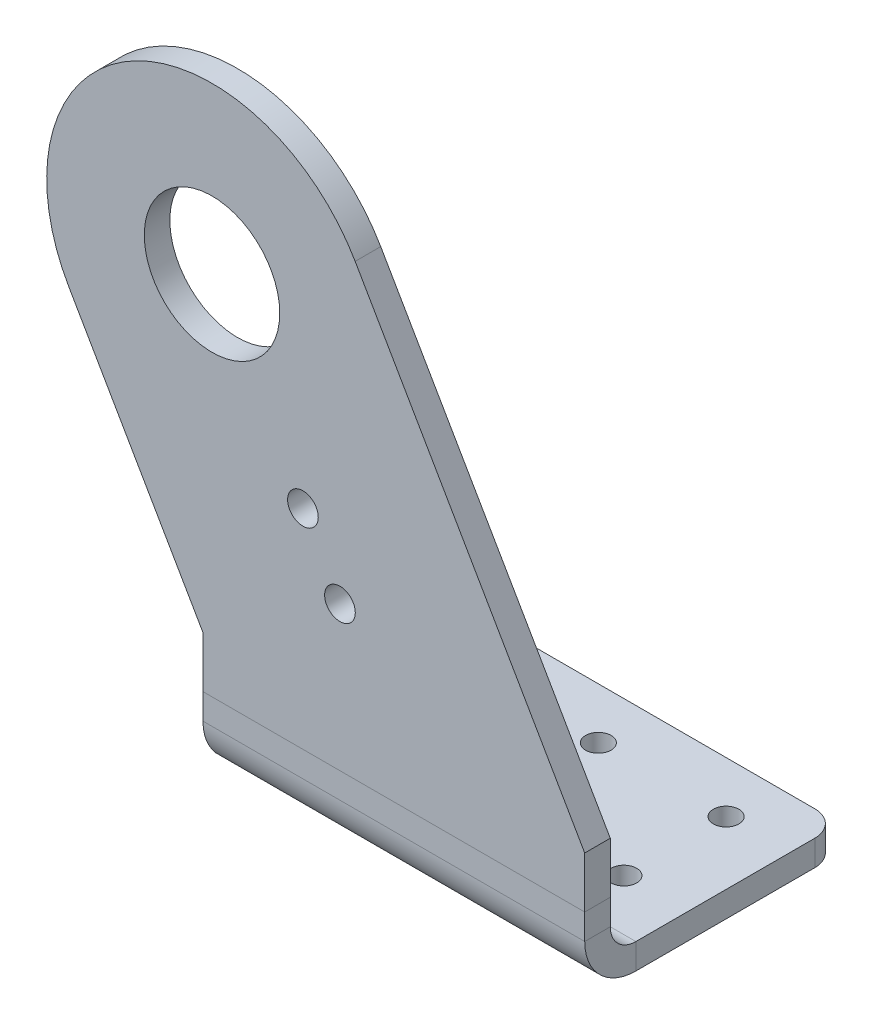
ISO-10303-21;
HEADER;
FILE_DESCRIPTION(('STEP AP214'),'2;1');
FILE_NAME('part.step','',(''),(''),'','','');
FILE_SCHEMA(('AUTOMOTIVE_DESIGN { 1 0 10303 214 1 1 1 1 }'));
ENDSEC;
DATA;
#1=APPLICATION_CONTEXT('core data for automotive mechanical design processes');
#2=APPLICATION_PROTOCOL_DEFINITION('international standard','automotive_design',2000,#1);
#3=PRODUCT_CONTEXT('',#1,'mechanical');
#4=PRODUCT('Part','Part','',(#3));
#5=PRODUCT_RELATED_PRODUCT_CATEGORY('part','',(#4));
#6=PRODUCT_DEFINITION_FORMATION('','',#4);
#7=PRODUCT_DEFINITION_CONTEXT('part definition',#1,'design');
#8=PRODUCT_DEFINITION('design','',#6,#7);
#9=PRODUCT_DEFINITION_SHAPE('','',#8);
#10=(LENGTH_UNIT() NAMED_UNIT(*) SI_UNIT(.MILLI.,.METRE.));
#11=(NAMED_UNIT(*) PLANE_ANGLE_UNIT() SI_UNIT($,.RADIAN.));
#12=(NAMED_UNIT(*) SI_UNIT($,.STERADIAN.) SOLID_ANGLE_UNIT());
#13=UNCERTAINTY_MEASURE_WITH_UNIT(LENGTH_MEASURE(1.E-05),#10,'distance_accuracy_value','');
#14=(GEOMETRIC_REPRESENTATION_CONTEXT(3) GLOBAL_UNCERTAINTY_ASSIGNED_CONTEXT((#13)) GLOBAL_UNIT_ASSIGNED_CONTEXT((#10,
#11,#12)) REPRESENTATION_CONTEXT('',''));
#15=CARTESIAN_POINT('',(0.,0.,0.));
#16=DIRECTION('',(0.,0.,1.));
#17=DIRECTION('',(1.,0.,0.));
#18=AXIS2_PLACEMENT_3D('',#15,#16,#17);
#19=CARTESIAN_POINT('',(51.5597538847893,-65.6863227653069,-5.));
#20=DIRECTION('',(1.,0.,0.));
#21=DIRECTION('',(0.,1.,0.));
#22=AXIS2_PLACEMENT_3D('',#19,#20,#21);
#23=PLANE('',#22);
#24=DIRECTION('',(0.,-1.,0.));
#25=VECTOR('',#24,1.);
#26=CARTESIAN_POINT('',(51.5597538847893,-65.6863227653069,-5.));
#27=LINE('',#26,#25);
#28=CARTESIAN_POINT('',(51.5597538847893,-65.6863227653069,-5.));
#29=VERTEX_POINT('',#28);
#30=CARTESIAN_POINT('',(51.5597538847893,-70.6863227653069,-5.));
#31=VERTEX_POINT('',#30);
#32=EDGE_CURVE('E181',#29,#31,#27,.T.);
#33=ORIENTED_EDGE('',*,*,#32,.F.);
#34=CARTESIAN_POINT('',(51.5597538847893,-60.6863227653069,-5.));
#35=DIRECTION('',(1.,0.,0.));
#36=DIRECTION('',(0.,1.,0.));
#37=AXIS2_PLACEMENT_3D('',#34,#35,#36);
#38=CIRCLE('',#37,5.);
#39=CARTESIAN_POINT('',(51.5597538847893,-60.6863227653069,0.));
#40=VERTEX_POINT('',#39);
#41=EDGE_CURVE('E222',#40,#29,#38,.T.);
#42=ORIENTED_EDGE('',*,*,#41,.F.);
#43=DIRECTION('',(0.,0.,-1.));
#44=VECTOR('',#43,1.);
#45=CARTESIAN_POINT('',(51.5597538847893,-60.6863227653069,5.));
#46=LINE('',#45,#44);
#47=CARTESIAN_POINT('',(51.5597538847893,-60.6863227653069,5.));
#48=VERTEX_POINT('',#47);
#49=EDGE_CURVE('E179',#48,#40,#46,.T.);
#50=ORIENTED_EDGE('',*,*,#49,.F.);
#51=CARTESIAN_POINT('',(51.5597538847893,-60.6863227653069,-5.));
#52=DIRECTION('',(1.,0.,0.));
#53=DIRECTION('',(0.,0.,-1.));
#54=AXIS2_PLACEMENT_3D('',#51,#52,#53);
#55=CIRCLE('',#54,10.);
#56=EDGE_CURVE('E178',#48,#31,#55,.T.);
#57=ORIENTED_EDGE('',*,*,#56,.T.);
#58=EDGE_LOOP('',(#33,#42,#50,#57));
#59=FACE_BOUND('',#58,.T.);
#60=ADVANCED_FACE('F51',(#59),#23,.T.);
#61=CARTESIAN_POINT('',(51.5597538847893,-60.6863227653069,5.));
#62=DIRECTION('',(1.,0.,0.));
#63=DIRECTION('',(0.,1.,0.));
#64=AXIS2_PLACEMENT_3D('',#61,#62,#63);
#65=PLANE('',#64);
#66=DIRECTION('',(0.,0.,-1.));
#67=VECTOR('',#66,1.);
#68=CARTESIAN_POINT('',(51.5597538847893,-70.6863227653069,-5.));
#69=LINE('',#68,#67);
#70=CARTESIAN_POINT('',(51.5597538847893,-70.6863227653069,-40.));
#71=VERTEX_POINT('',#70);
#72=EDGE_CURVE('E213',#31,#71,#69,.T.);
#73=ORIENTED_EDGE('',*,*,#72,.T.);
#74=DIRECTION('',(0.,-1.,0.));
#75=VECTOR('',#74,1.);
#76=CARTESIAN_POINT('',(51.5597538847893,-65.6863227653069,-40.));
#77=LINE('',#76,#75);
#78=CARTESIAN_POINT('',(51.5597538847893,-65.6863227653069,-40.));
#79=VERTEX_POINT('',#78);
#80=EDGE_CURVE('E12',#71,#79,#77,.F.);
#81=ORIENTED_EDGE('',*,*,#80,.T.);
#82=DIRECTION('',(0.,0.,-1.));
#83=VECTOR('',#82,1.);
#84=CARTESIAN_POINT('',(51.5597538847893,-65.6863227653069,-5.));
#85=LINE('',#84,#83);
#86=EDGE_CURVE('E219',#29,#79,#85,.T.);
#87=ORIENTED_EDGE('',*,*,#86,.F.);
#88=ORIENTED_EDGE('',*,*,#32,.T.);
#89=EDGE_LOOP('',(#73,#81,#87,#88));
#90=FACE_BOUND('',#89,.T.);
#91=ADVANCED_FACE('F253',(#90),#65,.T.);
#92=CARTESIAN_POINT('',(-75.3237340684686,-70.686322765307,-5.));
#93=DIRECTION('',(0.,-1.,0.));
#94=DIRECTION('',(1.,0.,0.));
#95=AXIS2_PLACEMENT_3D('',#92,#93,#94);
#96=PLANE('',#95);
#97=CARTESIAN_POINT('',(-10.7812238195632,-70.686322765307,-35.));
#98=DIRECTION('',(0.,1.,0.));
#99=DIRECTION('',(-1.,0.,0.));
#100=AXIS2_PLACEMENT_3D('',#97,#98,#99);
#101=CIRCLE('',#100,2.5);
#102=CARTESIAN_POINT('',(-13.2812238195632,-70.686322765307,-35.));
#103=VERTEX_POINT('',#102);
#104=EDGE_CURVE('E331',#103,#103,#101,.T.);
#105=ORIENTED_EDGE('',*,*,#104,.T.);
#106=EDGE_LOOP('',(#105));
#107=FACE_BOUND('',#106,.T.);
#108=CARTESIAN_POINT('',(-10.7812238195632,-70.686322765307,-15.));
#109=DIRECTION('',(0.,1.,0.));
#110=DIRECTION('',(-1.,0.,0.));
#111=AXIS2_PLACEMENT_3D('',#108,#109,#110);
#112=CIRCLE('',#111,2.5);
#113=CARTESIAN_POINT('',(-13.2812238195632,-70.686322765307,-15.));
#114=VERTEX_POINT('',#113);
#115=EDGE_CURVE('E338',#114,#114,#112,.T.);
#116=ORIENTED_EDGE('',*,*,#115,.T.);
#117=EDGE_LOOP('',(#116));
#118=FACE_BOUND('',#117,.T.);
#119=CARTESIAN_POINT('',(14.2187761804368,-70.686322765307,-15.));
#120=DIRECTION('',(0.,1.,0.));
#121=DIRECTION('',(-1.,0.,0.));
#122=AXIS2_PLACEMENT_3D('',#119,#120,#121);
#123=CIRCLE('',#122,2.5);
#124=CARTESIAN_POINT('',(11.7187761804368,-70.686322765307,-15.));
#125=VERTEX_POINT('',#124);
#126=EDGE_CURVE('E344',#125,#125,#123,.T.);
#127=ORIENTED_EDGE('',*,*,#126,.T.);
#128=EDGE_LOOP('',(#127));
#129=FACE_BOUND('',#128,.T.);
#130=CARTESIAN_POINT('',(39.2187761804368,-70.6863227653069,-15.));
#131=DIRECTION('',(0.,1.,0.));
#132=DIRECTION('',(1.,0.,0.));
#133=AXIS2_PLACEMENT_3D('',#130,#131,#132);
#134=CIRCLE('',#133,2.5);
#135=CARTESIAN_POINT('',(41.7187761804368,-70.6863227653069,-15.));
#136=VERTEX_POINT('',#135);
#137=EDGE_CURVE('E350',#136,#136,#134,.T.);
#138=ORIENTED_EDGE('',*,*,#137,.T.);
#139=EDGE_LOOP('',(#138));
#140=FACE_BOUND('',#139,.T.);
#141=CARTESIAN_POINT('',(39.2187761804368,-70.6863227653069,-35.));
#142=DIRECTION('',(0.,1.,0.));
#143=DIRECTION('',(1.,0.,0.));
#144=AXIS2_PLACEMENT_3D('',#141,#142,#143);
#145=CIRCLE('',#144,2.5);
#146=CARTESIAN_POINT('',(41.7187761804368,-70.6863227653069,-35.));
#147=VERTEX_POINT('',#146);
#148=EDGE_CURVE('E322',#147,#147,#145,.T.);
#149=ORIENTED_EDGE('',*,*,#148,.T.);
#150=EDGE_LOOP('',(#149));
#151=FACE_BOUND('',#150,.T.);
#152=CARTESIAN_POINT('',(14.2187761804368,-70.686322765307,-35.));
#153=DIRECTION('',(0.,1.,0.));
#154=DIRECTION('',(-1.,0.,0.));
#155=AXIS2_PLACEMENT_3D('',#152,#153,#154);
#156=CIRCLE('',#155,2.5);
#157=CARTESIAN_POINT('',(11.7187761804368,-70.686322765307,-35.));
#158=VERTEX_POINT('',#157);
#159=EDGE_CURVE('E160',#158,#158,#156,.T.);
#160=ORIENTED_EDGE('',*,*,#159,.T.);
#161=EDGE_LOOP('',(#160));
#162=FACE_BOUND('',#161,.T.);
#163=DIRECTION('',(0.,0.,1.));
#164=VECTOR('',#163,1.);
#165=CARTESIAN_POINT('',(-23.1222015239158,-70.6863227653069,-5.));
#166=LINE('',#165,#164);
#167=CARTESIAN_POINT('',(-23.1222015239158,-70.6863227653069,-40.));
#168=VERTEX_POINT('',#167);
#169=CARTESIAN_POINT('',(-23.1222015239158,-70.6863227653069,-5.));
#170=VERTEX_POINT('',#169);
#171=EDGE_CURVE('E199',#168,#170,#166,.T.);
#172=ORIENTED_EDGE('',*,*,#171,.F.);
#173=CARTESIAN_POINT('',(-18.1222015239158,-70.6863227653069,-40.));
#174=DIRECTION('',(0.,-1.,0.));
#175=DIRECTION('',(1.,0.,0.));
#176=AXIS2_PLACEMENT_3D('',#173,#174,#175);
#177=CIRCLE('',#176,5.);
#178=CARTESIAN_POINT('',(-18.1222015239158,-70.6863227653069,-45.));
#179=VERTEX_POINT('',#178);
#180=EDGE_CURVE('E59',#168,#179,#177,.T.);
#181=ORIENTED_EDGE('',*,*,#180,.T.);
#182=DIRECTION('',(1.,0.,0.));
#183=VECTOR('',#182,1.);
#184=CARTESIAN_POINT('',(-75.3237340684685,-70.686322765307,-45.));
#185=LINE('',#184,#183);
#186=CARTESIAN_POINT('',(46.5597538847893,-70.6863227653069,-45.));
#187=VERTEX_POINT('',#186);
#188=EDGE_CURVE('E176',#179,#187,#185,.T.);
#189=ORIENTED_EDGE('',*,*,#188,.T.);
#190=CARTESIAN_POINT('',(46.5597538847893,-70.6863227653069,-40.));
#191=DIRECTION('',(0.,-1.,0.));
#192=DIRECTION('',(1.,0.,0.));
#193=AXIS2_PLACEMENT_3D('',#190,#191,#192);
#194=CIRCLE('',#193,5.);
#195=EDGE_CURVE('E66',#187,#71,#194,.T.);
#196=ORIENTED_EDGE('',*,*,#195,.T.);
#197=ORIENTED_EDGE('',*,*,#72,.F.);
#198=DIRECTION('',(1.,0.,0.));
#199=VECTOR('',#198,1.);
#200=CARTESIAN_POINT('',(-75.3237340684686,-70.686322765307,-5.));
#201=LINE('',#200,#199);
#202=EDGE_CURVE('E182',#170,#31,#201,.T.);
#203=ORIENTED_EDGE('',*,*,#202,.F.);
#204=EDGE_LOOP('',(#172,#181,#189,#196,#197,#203));
#205=FACE_BOUND('',#204,.T.);
#206=ADVANCED_FACE('F197',(#107,#118,#129,#140,#151,#162,#205),#96,.T.);
#207=CARTESIAN_POINT('',(-75.3237340684686,-60.686322765307,-5.));
#208=DIRECTION('',(1.,0.,0.));
#209=DIRECTION('',(0.,1.,0.));
#210=AXIS2_PLACEMENT_3D('',#207,#208,#209);
#211=CYLINDRICAL_SURFACE('',#210,10.);
#212=DIRECTION('',(1.,0.,0.));
#213=VECTOR('',#212,1.);
#214=CARTESIAN_POINT('',(-75.3237340684686,-60.686322765307,5.));
#215=LINE('',#214,#213);
#216=CARTESIAN_POINT('',(-23.1222015239158,-60.6863227653069,5.));
#217=VERTEX_POINT('',#216);
#218=EDGE_CURVE('E235',#217,#48,#215,.T.);
#219=ORIENTED_EDGE('',*,*,#218,.F.);
#220=CARTESIAN_POINT('',(-23.1222015239158,-60.6863227653069,-5.));
#221=DIRECTION('',(-1.,0.,0.));
#222=DIRECTION('',(0.,-1.,0.));
#223=AXIS2_PLACEMENT_3D('',#220,#221,#222);
#224=CIRCLE('',#223,10.);
#225=EDGE_CURVE('E137',#170,#217,#224,.T.);
#226=ORIENTED_EDGE('',*,*,#225,.F.);
#227=ORIENTED_EDGE('',*,*,#202,.T.);
#228=ORIENTED_EDGE('',*,*,#56,.F.);
#229=EDGE_LOOP('',(#219,#226,#227,#228));
#230=FACE_BOUND('',#229,.T.);
#231=ADVANCED_FACE('F249',(#230),#211,.T.);
#232=CARTESIAN_POINT('',(-75.3237340684686,-55.686322765307,5.));
#233=DIRECTION('',(0.,0.,1.));
#234=DIRECTION('',(0.,-1.,0.));
#235=AXIS2_PLACEMENT_3D('',#232,#233,#234);
#236=PLANE('',#235);
#237=DIRECTION('',(1.,0.,0.));
#238=VECTOR('',#237,1.);
#239=CARTESIAN_POINT('',(-75.3237340684686,-55.686322765307,5.));
#240=LINE('',#239,#238);
#241=CARTESIAN_POINT('',(-23.1222015239158,-55.6863227653069,5.));
#242=VERTEX_POINT('',#241);
#243=CARTESIAN_POINT('',(51.5597538847893,-55.6863227653069,5.));
#244=VERTEX_POINT('',#243);
#245=EDGE_CURVE('E168',#242,#244,#240,.T.);
#246=ORIENTED_EDGE('',*,*,#245,.F.);
#247=DIRECTION('',(0.,-1.,0.));
#248=VECTOR('',#247,1.);
#249=CARTESIAN_POINT('',(-23.1222015239158,-55.686322765307,5.));
#250=LINE('',#249,#248);
#251=EDGE_CURVE('E141',#217,#242,#250,.F.);
#252=ORIENTED_EDGE('',*,*,#251,.F.);
#253=ORIENTED_EDGE('',*,*,#218,.T.);
#254=DIRECTION('',(0.,-1.,0.));
#255=VECTOR('',#254,1.);
#256=CARTESIAN_POINT('',(51.5597538847893,-55.6863227653069,5.));
#257=LINE('',#256,#255);
#258=EDGE_CURVE('E228',#244,#48,#257,.T.);
#259=ORIENTED_EDGE('',*,*,#258,.F.);
#260=EDGE_LOOP('',(#246,#252,#253,#259));
#261=FACE_BOUND('',#260,.T.);
#262=ADVANCED_FACE('F246',(#261),#236,.T.);
#263=CARTESIAN_POINT('',(-75.3237340684686,-55.686322765307,5.));
#264=DIRECTION('',(0.,-1.,0.));
#265=DIRECTION('',(1.,0.,0.));
#266=AXIS2_PLACEMENT_3D('',#263,#264,#265);
#267=PLANE('',#266);
#268=DIRECTION('',(0.,0.,-1.));
#269=VECTOR('',#268,1.);
#270=CARTESIAN_POINT('',(-23.1222015239158,-55.6863227653069,0.));
#271=LINE('',#270,#269);
#272=CARTESIAN_POINT('',(-23.1222015239158,-55.6863227653069,0.));
#273=VERTEX_POINT('',#272);
#274=EDGE_CURVE('E140',#273,#242,#271,.F.);
#275=ORIENTED_EDGE('',*,*,#274,.T.);
#276=ORIENTED_EDGE('',*,*,#245,.T.);
#277=DIRECTION('',(0.,0.,-1.));
#278=VECTOR('',#277,1.);
#279=CARTESIAN_POINT('',(51.5597538847893,-55.6863227653069,5.));
#280=LINE('',#279,#278);
#281=CARTESIAN_POINT('',(51.5597538847893,-55.6863227653069,0.));
#282=VERTEX_POINT('',#281);
#283=EDGE_CURVE('E225',#244,#282,#280,.T.);
#284=ORIENTED_EDGE('',*,*,#283,.T.);
#285=DIRECTION('',(1.,0.,0.));
#286=VECTOR('',#285,1.);
#287=CARTESIAN_POINT('',(-75.3237340684686,-55.686322765307,0.));
#288=LINE('',#287,#286);
#289=EDGE_CURVE('E166',#273,#282,#288,.T.);
#290=ORIENTED_EDGE('',*,*,#289,.F.);
#291=EDGE_LOOP('',(#275,#276,#284,#290));
#292=FACE_BOUND('',#291,.T.);
#293=ADVANCED_FACE('F240',(#292),#267,.F.);
#294=CARTESIAN_POINT('',(-75.3237340684686,-55.686322765307,0.));
#295=DIRECTION('',(0.,0.,1.));
#296=DIRECTION('',(0.,-1.,0.));
#297=AXIS2_PLACEMENT_3D('',#294,#295,#296);
#298=PLANE('',#297);
#299=DIRECTION('',(0.,1.,0.));
#300=VECTOR('',#299,1.);
#301=CARTESIAN_POINT('',(-23.1222015239158,-55.6863227653071,0.));
#302=LINE('',#301,#300);
#303=CARTESIAN_POINT('',(-23.1222015239158,-60.6863227653069,0.));
#304=VERTEX_POINT('',#303);
#305=EDGE_CURVE('E144',#304,#273,#302,.T.);
#306=ORIENTED_EDGE('',*,*,#305,.T.);
#307=ORIENTED_EDGE('',*,*,#289,.T.);
#308=DIRECTION('',(0.,-1.,0.));
#309=VECTOR('',#308,1.);
#310=CARTESIAN_POINT('',(51.5597538847893,-55.6863227653069,0.));
#311=LINE('',#310,#309);
#312=EDGE_CURVE('E164',#282,#40,#311,.T.);
#313=ORIENTED_EDGE('',*,*,#312,.T.);
#314=DIRECTION('',(1.,0.,0.));
#315=VECTOR('',#314,1.);
#316=CARTESIAN_POINT('',(-75.3237340684686,-60.686322765307,0.));
#317=LINE('',#316,#315);
#318=EDGE_CURVE('E156',#304,#40,#317,.T.);
#319=ORIENTED_EDGE('',*,*,#318,.F.);
#320=EDGE_LOOP('',(#306,#307,#313,#319));
#321=FACE_BOUND('',#320,.T.);
#322=ADVANCED_FACE('F162',(#321),#298,.F.);
#323=CARTESIAN_POINT('',(-75.3237340684686,-60.686322765307,-5.));
#324=DIRECTION('',(1.,0.,0.));
#325=DIRECTION('',(0.,1.,0.));
#326=AXIS2_PLACEMENT_3D('',#323,#324,#325);
#327=CYLINDRICAL_SURFACE('',#326,5.);
#328=CARTESIAN_POINT('',(-23.1222015239158,-60.6863227653069,-5.));
#329=DIRECTION('',(1.,0.,0.));
#330=DIRECTION('',(0.,1.,0.));
#331=AXIS2_PLACEMENT_3D('',#328,#329,#330);
#332=CIRCLE('',#331,5.);
#333=CARTESIAN_POINT('',(-23.1222015239158,-65.6863227653069,-5.));
#334=VERTEX_POINT('',#333);
#335=EDGE_CURVE('E134',#334,#304,#332,.F.);
#336=ORIENTED_EDGE('',*,*,#335,.T.);
#337=ORIENTED_EDGE('',*,*,#318,.T.);
#338=ORIENTED_EDGE('',*,*,#41,.T.);
#339=DIRECTION('',(1.,0.,0.));
#340=VECTOR('',#339,1.);
#341=CARTESIAN_POINT('',(-75.3237340684686,-65.686322765307,-5.));
#342=LINE('',#341,#340);
#343=EDGE_CURVE('E159',#334,#29,#342,.T.);
#344=ORIENTED_EDGE('',*,*,#343,.F.);
#345=EDGE_LOOP('',(#336,#337,#338,#344));
#346=FACE_BOUND('',#345,.T.);
#347=ADVANCED_FACE('F154',(#346),#327,.F.);
#348=CARTESIAN_POINT('',(-75.3237340684685,-65.686322765307,-5.));
#349=DIRECTION('',(0.,-1.,0.));
#350=DIRECTION('',(1.,0.,0.));
#351=AXIS2_PLACEMENT_3D('',#348,#349,#350);
#352=PLANE('',#351);
#353=CARTESIAN_POINT('',(-10.7812238195632,-65.6863227653069,-35.));
#354=DIRECTION('',(0.,1.,0.));
#355=DIRECTION('',(-1.,0.,0.));
#356=AXIS2_PLACEMENT_3D('',#353,#354,#355);
#357=CIRCLE('',#356,2.5);
#358=CARTESIAN_POINT('',(-13.2812238195632,-65.6863227653069,-35.));
#359=VERTEX_POINT('',#358);
#360=EDGE_CURVE('E335',#359,#359,#357,.T.);
#361=ORIENTED_EDGE('',*,*,#360,.F.);
#362=EDGE_LOOP('',(#361));
#363=FACE_BOUND('',#362,.T.);
#364=CARTESIAN_POINT('',(-10.7812238195632,-65.6863227653069,-15.));
#365=DIRECTION('',(0.,1.,0.));
#366=DIRECTION('',(-1.,0.,0.));
#367=AXIS2_PLACEMENT_3D('',#364,#365,#366);
#368=CIRCLE('',#367,2.5);
#369=CARTESIAN_POINT('',(-13.2812238195632,-65.6863227653069,-15.));
#370=VERTEX_POINT('',#369);
#371=EDGE_CURVE('E341',#370,#370,#368,.T.);
#372=ORIENTED_EDGE('',*,*,#371,.F.);
#373=EDGE_LOOP('',(#372));
#374=FACE_BOUND('',#373,.T.);
#375=CARTESIAN_POINT('',(14.2187761804368,-65.6863227653069,-15.));
#376=DIRECTION('',(0.,1.,0.));
#377=DIRECTION('',(-1.,0.,0.));
#378=AXIS2_PLACEMENT_3D('',#375,#376,#377);
#379=CIRCLE('',#378,2.5);
#380=CARTESIAN_POINT('',(11.7187761804368,-65.6863227653069,-15.));
#381=VERTEX_POINT('',#380);
#382=EDGE_CURVE('E347',#381,#381,#379,.T.);
#383=ORIENTED_EDGE('',*,*,#382,.F.);
#384=EDGE_LOOP('',(#383));
#385=FACE_BOUND('',#384,.T.);
#386=CARTESIAN_POINT('',(39.2187761804368,-65.6863227653069,-15.));
#387=DIRECTION('',(0.,1.,0.));
#388=DIRECTION('',(1.,0.,0.));
#389=AXIS2_PLACEMENT_3D('',#386,#387,#388);
#390=CIRCLE('',#389,2.5);
#391=CARTESIAN_POINT('',(41.7187761804368,-65.6863227653069,-15.));
#392=VERTEX_POINT('',#391);
#393=EDGE_CURVE('E328',#392,#392,#390,.T.);
#394=ORIENTED_EDGE('',*,*,#393,.F.);
#395=EDGE_LOOP('',(#394));
#396=FACE_BOUND('',#395,.T.);
#397=CARTESIAN_POINT('',(39.2187761804368,-65.6863227653069,-35.));
#398=DIRECTION('',(0.,1.,0.));
#399=DIRECTION('',(1.,0.,0.));
#400=AXIS2_PLACEMENT_3D('',#397,#398,#399);
#401=CIRCLE('',#400,2.5);
#402=CARTESIAN_POINT('',(41.7187761804368,-65.6863227653069,-35.));
#403=VERTEX_POINT('',#402);
#404=EDGE_CURVE('E325',#403,#403,#401,.T.);
#405=ORIENTED_EDGE('',*,*,#404,.F.);
#406=EDGE_LOOP('',(#405));
#407=FACE_BOUND('',#406,.T.);
#408=CARTESIAN_POINT('',(14.2187761804368,-65.6863227653069,-35.));
#409=DIRECTION('',(0.,1.,0.));
#410=DIRECTION('',(-1.,0.,0.));
#411=AXIS2_PLACEMENT_3D('',#408,#409,#410);
#412=CIRCLE('',#411,2.5);
#413=CARTESIAN_POINT('',(11.7187761804368,-65.6863227653069,-35.));
#414=VERTEX_POINT('',#413);
#415=EDGE_CURVE('E334',#414,#414,#412,.T.);
#416=ORIENTED_EDGE('',*,*,#415,.F.);
#417=EDGE_LOOP('',(#416));
#418=FACE_BOUND('',#417,.T.);
#419=DIRECTION('',(1.,0.,0.));
#420=VECTOR('',#419,1.);
#421=CARTESIAN_POINT('',(-75.3237340684685,-65.686322765307,-45.));
#422=LINE('',#421,#420);
#423=CARTESIAN_POINT('',(-18.1222015239158,-65.6863227653069,-45.));
#424=VERTEX_POINT('',#423);
#425=CARTESIAN_POINT('',(46.5597538847893,-65.6863227653069,-45.));
#426=VERTEX_POINT('',#425);
#427=EDGE_CURVE('E170',#424,#426,#422,.T.);
#428=ORIENTED_EDGE('',*,*,#427,.F.);
#429=CARTESIAN_POINT('',(-18.1222015239158,-65.6863227653069,-40.));
#430=DIRECTION('',(0.,-1.,0.));
#431=DIRECTION('',(1.,0.,0.));
#432=AXIS2_PLACEMENT_3D('',#429,#430,#431);
#433=CIRCLE('',#432,5.);
#434=CARTESIAN_POINT('',(-23.1222015239158,-65.6863227653069,-40.));
#435=VERTEX_POINT('',#434);
#436=EDGE_CURVE('E192',#424,#435,#433,.F.);
#437=ORIENTED_EDGE('',*,*,#436,.T.);
#438=DIRECTION('',(0.,0.,1.));
#439=VECTOR('',#438,1.);
#440=CARTESIAN_POINT('',(-23.1222015239158,-65.6863227653069,-5.));
#441=LINE('',#440,#439);
#442=EDGE_CURVE('E209',#435,#334,#441,.T.);
#443=ORIENTED_EDGE('',*,*,#442,.T.);
#444=ORIENTED_EDGE('',*,*,#343,.T.);
#445=ORIENTED_EDGE('',*,*,#86,.T.);
#446=CARTESIAN_POINT('',(46.5597538847893,-65.6863227653069,-40.));
#447=DIRECTION('',(0.,-1.,0.));
#448=DIRECTION('',(1.,0.,0.));
#449=AXIS2_PLACEMENT_3D('',#446,#447,#448);
#450=CIRCLE('',#449,5.);
#451=EDGE_CURVE('E190',#79,#426,#450,.F.);
#452=ORIENTED_EDGE('',*,*,#451,.T.);
#453=EDGE_LOOP('',(#428,#437,#443,#444,#445,#452));
#454=FACE_BOUND('',#453,.T.);
#455=ADVANCED_FACE('F208',(#363,#374,#385,#396,#407,#418,#454),#352,.F.);
#456=CARTESIAN_POINT('',(-75.3237340684685,-65.686322765307,-45.));
#457=DIRECTION('',(0.,0.,1.));
#458=DIRECTION('',(1.,0.,0.));
#459=AXIS2_PLACEMENT_3D('',#456,#457,#458);
#460=PLANE('',#459);
#461=ORIENTED_EDGE('',*,*,#188,.F.);
#462=DIRECTION('',(0.,-1.,0.));
#463=VECTOR('',#462,1.);
#464=CARTESIAN_POINT('',(-18.1222015239158,-65.6863227653069,-45.));
#465=LINE('',#464,#463);
#466=EDGE_CURVE('E187',#179,#424,#465,.F.);
#467=ORIENTED_EDGE('',*,*,#466,.T.);
#468=ORIENTED_EDGE('',*,*,#427,.T.);
#469=DIRECTION('',(0.,-1.,0.));
#470=VECTOR('',#469,1.);
#471=CARTESIAN_POINT('',(46.5597538847893,-70.6863227653069,-45.));
#472=LINE('',#471,#470);
#473=EDGE_CURVE('E184',#426,#187,#472,.T.);
#474=ORIENTED_EDGE('',*,*,#473,.T.);
#475=EDGE_LOOP('',(#461,#467,#468,#474));
#476=FACE_BOUND('',#475,.T.);
#477=ADVANCED_FACE('F203',(#476),#460,.F.);
#478=CARTESIAN_POINT('',(51.5597538847893,-60.6863227653069,-5.));
#479=DIRECTION('',(1.,0.,0.));
#480=DIRECTION('',(0.,0.,-1.));
#481=AXIS2_PLACEMENT_3D('',#478,#479,#480);
#482=PLANE('',#481);
#483=ORIENTED_EDGE('',*,*,#258,.T.);
#484=ORIENTED_EDGE('',*,*,#49,.T.);
#485=ORIENTED_EDGE('',*,*,#312,.F.);
#486=ORIENTED_EDGE('',*,*,#283,.F.);
#487=EDGE_LOOP('',(#483,#484,#485,#486));
#488=FACE_BOUND('',#487,.T.);
#489=ADVANCED_FACE('F244',(#488),#482,.T.);
#490=CARTESIAN_POINT('',(-23.1222015239158,-70.6863227653069,-5.));
#491=DIRECTION('',(1.,0.,0.));
#492=DIRECTION('',(0.,0.,1.));
#493=AXIS2_PLACEMENT_3D('',#490,#491,#492);
#494=PLANE('',#493);
#495=ORIENTED_EDGE('',*,*,#442,.F.);
#496=DIRECTION('',(0.,1.,0.));
#497=VECTOR('',#496,1.);
#498=CARTESIAN_POINT('',(-23.1222015239158,-70.6863227653069,-40.));
#499=LINE('',#498,#497);
#500=EDGE_CURVE('E74',#435,#168,#499,.F.);
#501=ORIENTED_EDGE('',*,*,#500,.T.);
#502=ORIENTED_EDGE('',*,*,#171,.T.);
#503=DIRECTION('',(0.,-1.,0.));
#504=VECTOR('',#503,1.);
#505=CARTESIAN_POINT('',(-23.1222015239158,-70.6863227653069,-5.));
#506=LINE('',#505,#504);
#507=EDGE_CURVE('E211',#170,#334,#506,.F.);
#508=ORIENTED_EDGE('',*,*,#507,.T.);
#509=EDGE_LOOP('',(#495,#501,#502,#508));
#510=FACE_BOUND('',#509,.T.);
#511=ADVANCED_FACE('F210',(#510),#494,.F.);
#512=CARTESIAN_POINT('',(-23.1222015239158,-55.6863227653071,0.));
#513=DIRECTION('',(1.,0.,0.));
#514=DIRECTION('',(0.,1.,0.));
#515=AXIS2_PLACEMENT_3D('',#512,#513,#514);
#516=PLANE('',#515);
#517=ORIENTED_EDGE('',*,*,#274,.F.);
#518=ORIENTED_EDGE('',*,*,#305,.F.);
#519=DIRECTION('',(0.,0.,-1.));
#520=VECTOR('',#519,1.);
#521=CARTESIAN_POINT('',(-23.1222015239158,-60.6863227653069,0.));
#522=LINE('',#521,#520);
#523=EDGE_CURVE('E129',#304,#217,#522,.F.);
#524=ORIENTED_EDGE('',*,*,#523,.T.);
#525=ORIENTED_EDGE('',*,*,#251,.T.);
#526=EDGE_LOOP('',(#517,#518,#524,#525));
#527=FACE_BOUND('',#526,.T.);
#528=ADVANCED_FACE('F145',(#527),#516,.F.);
#529=CARTESIAN_POINT('',(-23.1222015239158,-60.6863227653069,-5.));
#530=DIRECTION('',(-1.,0.,0.));
#531=DIRECTION('',(0.,-1.,0.));
#532=AXIS2_PLACEMENT_3D('',#529,#530,#531);
#533=PLANE('',#532);
#534=ORIENTED_EDGE('',*,*,#225,.T.);
#535=ORIENTED_EDGE('',*,*,#523,.F.);
#536=ORIENTED_EDGE('',*,*,#335,.F.);
#537=ORIENTED_EDGE('',*,*,#507,.F.);
#538=EDGE_LOOP('',(#534,#535,#536,#537));
#539=FACE_BOUND('',#538,.T.);
#540=ADVANCED_FACE('F131',(#539),#533,.T.);
#541=CARTESIAN_POINT('',(14.2187761804368,-70.686322765307,-35.));
#542=DIRECTION('',(0.,1.,0.));
#543=DIRECTION('',(-1.,0.,0.));
#544=AXIS2_PLACEMENT_3D('',#541,#542,#543);
#545=CYLINDRICAL_SURFACE('',#544,2.5);
#546=ORIENTED_EDGE('',*,*,#159,.F.);
#547=EDGE_LOOP('',(#546));
#548=FACE_BOUND('',#547,.T.);
#549=ORIENTED_EDGE('',*,*,#415,.T.);
#550=EDGE_LOOP('',(#549));
#551=FACE_BOUND('',#550,.T.);
#552=ADVANCED_FACE('F295',(#548,#551),#545,.F.);
#553=CARTESIAN_POINT('',(39.2187761804368,-70.6863227653069,-35.));
#554=DIRECTION('',(0.,1.,0.));
#555=DIRECTION('',(-1.,0.,0.));
#556=AXIS2_PLACEMENT_3D('',#553,#554,#555);
#557=CYLINDRICAL_SURFACE('',#556,2.5);
#558=ORIENTED_EDGE('',*,*,#148,.F.);
#559=EDGE_LOOP('',(#558));
#560=FACE_BOUND('',#559,.T.);
#561=ORIENTED_EDGE('',*,*,#404,.T.);
#562=EDGE_LOOP('',(#561));
#563=FACE_BOUND('',#562,.T.);
#564=ADVANCED_FACE('F298',(#560,#563),#557,.F.);
#565=CARTESIAN_POINT('',(39.2187761804368,-70.6863227653069,-15.));
#566=DIRECTION('',(0.,1.,0.));
#567=DIRECTION('',(-1.,0.,0.));
#568=AXIS2_PLACEMENT_3D('',#565,#566,#567);
#569=CYLINDRICAL_SURFACE('',#568,2.5);
#570=ORIENTED_EDGE('',*,*,#137,.F.);
#571=EDGE_LOOP('',(#570));
#572=FACE_BOUND('',#571,.T.);
#573=ORIENTED_EDGE('',*,*,#393,.T.);
#574=EDGE_LOOP('',(#573));
#575=FACE_BOUND('',#574,.T.);
#576=ADVANCED_FACE('F300',(#572,#575),#569,.F.);
#577=CARTESIAN_POINT('',(14.2187761804368,-70.686322765307,-15.));
#578=DIRECTION('',(0.,1.,0.));
#579=DIRECTION('',(-1.,0.,0.));
#580=AXIS2_PLACEMENT_3D('',#577,#578,#579);
#581=CYLINDRICAL_SURFACE('',#580,2.5);
#582=ORIENTED_EDGE('',*,*,#126,.F.);
#583=EDGE_LOOP('',(#582));
#584=FACE_BOUND('',#583,.T.);
#585=ORIENTED_EDGE('',*,*,#382,.T.);
#586=EDGE_LOOP('',(#585));
#587=FACE_BOUND('',#586,.T.);
#588=ADVANCED_FACE('F303',(#584,#587),#581,.F.);
#589=CARTESIAN_POINT('',(-10.7812238195632,-70.686322765307,-15.));
#590=DIRECTION('',(0.,1.,0.));
#591=DIRECTION('',(-1.,0.,0.));
#592=AXIS2_PLACEMENT_3D('',#589,#590,#591);
#593=CYLINDRICAL_SURFACE('',#592,2.5);
#594=ORIENTED_EDGE('',*,*,#115,.F.);
#595=EDGE_LOOP('',(#594));
#596=FACE_BOUND('',#595,.T.);
#597=ORIENTED_EDGE('',*,*,#371,.T.);
#598=EDGE_LOOP('',(#597));
#599=FACE_BOUND('',#598,.T.);
#600=ADVANCED_FACE('F307',(#596,#599),#593,.F.);
#601=CARTESIAN_POINT('',(-10.7812238195632,-70.686322765307,-35.));
#602=DIRECTION('',(0.,1.,0.));
#603=DIRECTION('',(-1.,0.,0.));
#604=AXIS2_PLACEMENT_3D('',#601,#602,#603);
#605=CYLINDRICAL_SURFACE('',#604,2.5);
#606=ORIENTED_EDGE('',*,*,#104,.F.);
#607=EDGE_LOOP('',(#606));
#608=FACE_BOUND('',#607,.T.);
#609=ORIENTED_EDGE('',*,*,#360,.T.);
#610=EDGE_LOOP('',(#609));
#611=FACE_BOUND('',#610,.T.);
#612=ADVANCED_FACE('F261',(#608,#611),#605,.F.);
#613=CARTESIAN_POINT('',(-18.1222015239158,-65.6863227653069,-40.));
#614=DIRECTION('',(0.,1.,0.));
#615=DIRECTION('',(-1.,0.,0.));
#616=AXIS2_PLACEMENT_3D('',#613,#614,#615);
#617=CYLINDRICAL_SURFACE('',#616,5.);
#618=ORIENTED_EDGE('',*,*,#180,.F.);
#619=ORIENTED_EDGE('',*,*,#500,.F.);
#620=ORIENTED_EDGE('',*,*,#436,.F.);
#621=ORIENTED_EDGE('',*,*,#466,.F.);
#622=EDGE_LOOP('',(#618,#619,#620,#621));
#623=FACE_BOUND('',#622,.T.);
#624=ADVANCED_FACE('F206',(#623),#617,.T.);
#625=CARTESIAN_POINT('',(46.5597538847893,-65.6863227653069,-40.));
#626=DIRECTION('',(0.,1.,0.));
#627=DIRECTION('',(-1.,0.,0.));
#628=AXIS2_PLACEMENT_3D('',#625,#626,#627);
#629=CYLINDRICAL_SURFACE('',#628,5.);
#630=ORIENTED_EDGE('',*,*,#451,.F.);
#631=ORIENTED_EDGE('',*,*,#80,.F.);
#632=ORIENTED_EDGE('',*,*,#195,.F.);
#633=ORIENTED_EDGE('',*,*,#473,.F.);
#634=EDGE_LOOP('',(#630,#631,#632,#633));
#635=FACE_BOUND('',#634,.T.);
#636=ADVANCED_FACE('F53',(#635),#629,.T.);
#637=CLOSED_SHELL('',(#60,#91,#206,#231,#262,#293,#322,#347,#455,#477,#489,#511,#528,#540,#552,
#564,#576,#588,#600,#612,#624,#636));
#638=MANIFOLD_SOLID_BREP('B2',#637);
#639=CARTESIAN_POINT('',(51.5597538847893,0.,5.));
#640=DIRECTION('',(1.,0.,0.));
#641=DIRECTION('',(0.,1.,0.));
#642=AXIS2_PLACEMENT_3D('',#639,#640,#641);
#643=PLANE('',#642);
#644=DIRECTION('',(0.,-1.,0.));
#645=VECTOR('',#644,1.);
#646=CARTESIAN_POINT('',(51.5597538847893,0.,0.));
#647=LINE('',#646,#645);
#648=CARTESIAN_POINT('',(51.5597538847893,-45.6863227653068,0.));
#649=VERTEX_POINT('',#648);
#650=CARTESIAN_POINT('',(51.5597538847893,-55.6863227653069,0.));
#651=VERTEX_POINT('',#650);
#652=EDGE_CURVE('E632',#649,#651,#647,.T.);
#653=ORIENTED_EDGE('',*,*,#652,.F.);
#654=DIRECTION('',(0.,0.,-1.));
#655=VECTOR('',#654,1.);
#656=CARTESIAN_POINT('',(51.5597538847893,-45.6863227653068,5.));
#657=LINE('',#656,#655);
#658=CARTESIAN_POINT('',(51.5597538847893,-45.6863227653068,5.));
#659=VERTEX_POINT('',#658);
#660=EDGE_CURVE('E49',#659,#649,#657,.T.);
#661=ORIENTED_EDGE('',*,*,#660,.F.);
#662=DIRECTION('',(0.,-1.,0.));
#663=VECTOR('',#662,1.);
#664=CARTESIAN_POINT('',(51.5597538847893,0.,5.));
#665=LINE('',#664,#663);
#666=CARTESIAN_POINT('',(51.5597538847893,-55.6863227653069,5.));
#667=VERTEX_POINT('',#666);
#668=EDGE_CURVE('E653',#659,#667,#665,.T.);
#669=ORIENTED_EDGE('',*,*,#668,.T.);
#670=DIRECTION('',(0.,0.,-1.));
#671=VECTOR('',#670,1.);
#672=CARTESIAN_POINT('',(51.5597538847893,-55.6863227653069,5.));
#673=LINE('',#672,#671);
#674=EDGE_CURVE('E586',#667,#651,#673,.T.);
#675=ORIENTED_EDGE('',*,*,#674,.T.);
#676=EDGE_LOOP('',(#653,#661,#669,#675));
#677=FACE_BOUND('',#676,.T.);
#678=ADVANCED_FACE('F541',(#677),#643,.T.);
#679=CARTESIAN_POINT('',(18.8870573534665,10.9044476472238,5.));
#680=DIRECTION('',(0.866025403784439,0.5,0.));
#681=DIRECTION('',(-0.5,0.866025403784439,0.));
#682=AXIS2_PLACEMENT_3D('',#679,#680,#681);
#683=PLANE('',#682);
#684=DIRECTION('',(0.5,-0.866025403784439,0.));
#685=VECTOR('',#684,1.);
#686=CARTESIAN_POINT('',(18.8870573534665,10.9044476472238,0.));
#687=LINE('',#686,#685);
#688=CARTESIAN_POINT('',(6.65140441207909,32.0972202054862,0.));
#689=VERTEX_POINT('',#688);
#690=EDGE_CURVE('E635',#689,#649,#687,.T.);
#691=ORIENTED_EDGE('',*,*,#690,.F.);
#692=DIRECTION('',(0.,0.,-1.));
#693=VECTOR('',#692,1.);
#694=CARTESIAN_POINT('',(6.65140441207909,32.0972202054862,5.));
#695=LINE('',#694,#693);
#696=CARTESIAN_POINT('',(6.65140441207909,32.0972202054862,5.));
#697=VERTEX_POINT('',#696);
#698=EDGE_CURVE('E549',#697,#689,#695,.T.);
#699=ORIENTED_EDGE('',*,*,#698,.F.);
#700=DIRECTION('',(0.5,-0.866025403784439,0.));
#701=VECTOR('',#700,1.);
#702=CARTESIAN_POINT('',(18.8870573534665,10.9044476472238,5.));
#703=LINE('',#702,#701);
#704=EDGE_CURVE('E666',#697,#659,#703,.T.);
#705=ORIENTED_EDGE('',*,*,#704,.T.);
#706=ORIENTED_EDGE('',*,*,#660,.T.);
#707=EDGE_LOOP('',(#691,#699,#705,#706));
#708=FACE_BOUND('',#707,.T.);
#709=ADVANCED_FACE('F665',(#708),#683,.T.);
#710=CARTESIAN_POINT('',(-21.3543288661853,15.9281025584274,5.));
#711=DIRECTION('',(0.,0.,-1.));
#712=DIRECTION('',(-1.,0.,0.));
#713=AXIS2_PLACEMENT_3D('',#710,#711,#712);
#714=CYLINDRICAL_SURFACE('',#713,32.3382352941176);
#715=CARTESIAN_POINT('',(-21.3543288661853,15.9281025584274,0.));
#716=DIRECTION('',(0.,0.,1.));
#717=DIRECTION('',(1.,0.,0.));
#718=AXIS2_PLACEMENT_3D('',#715,#716,#717);
#719=CIRCLE('',#718,32.3382352941176);
#720=CARTESIAN_POINT('',(-49.3600621444497,-0.24101508863144,0.));
#721=VERTEX_POINT('',#720);
#722=EDGE_CURVE('E638',#689,#721,#719,.T.);
#723=ORIENTED_EDGE('',*,*,#722,.T.);
#724=DIRECTION('',(0.,0.,-1.));
#725=VECTOR('',#724,1.);
#726=CARTESIAN_POINT('',(-49.3600621444497,-0.24101508863144,5.));
#727=LINE('',#726,#725);
#728=CARTESIAN_POINT('',(-49.3600621444497,-0.24101508863144,5.));
#729=VERTEX_POINT('',#728);
#730=EDGE_CURVE('E615',#729,#721,#727,.T.);
#731=ORIENTED_EDGE('',*,*,#730,.F.);
#732=CARTESIAN_POINT('',(-21.3543288661853,15.9281025584274,5.));
#733=DIRECTION('',(0.,0.,1.));
#734=DIRECTION('',(1.,0.,0.));
#735=AXIS2_PLACEMENT_3D('',#732,#733,#734);
#736=CIRCLE('',#735,32.3382352941176);
#737=EDGE_CURVE('E606',#697,#729,#736,.T.);
#738=ORIENTED_EDGE('',*,*,#737,.F.);
#739=ORIENTED_EDGE('',*,*,#698,.T.);
#740=EDGE_LOOP('',(#723,#731,#738,#739));
#741=FACE_BOUND('',#740,.T.);
#742=ADVANCED_FACE('F658',(#741),#714,.T.);
#743=CARTESIAN_POINT('',(-37.1244092030624,-21.4337876468939,5.));
#744=DIRECTION('',(0.866025403784438,0.5,0.));
#745=DIRECTION('',(-0.5,0.866025403784438,0.));
#746=AXIS2_PLACEMENT_3D('',#743,#744,#745);
#747=PLANE('',#746);
#748=DIRECTION('',(0.5,-0.866025403784438,0.));
#749=VECTOR('',#748,1.);
#750=CARTESIAN_POINT('',(-37.1244092030624,-21.4337876468939,0.));
#751=LINE('',#750,#749);
#752=CARTESIAN_POINT('',(-23.1222015239158,-45.6863227653069,0.));
#753=VERTEX_POINT('',#752);
#754=EDGE_CURVE('E614',#721,#753,#751,.T.);
#755=ORIENTED_EDGE('',*,*,#754,.T.);
#756=DIRECTION('',(0.,0.,-1.));
#757=VECTOR('',#756,1.);
#758=CARTESIAN_POINT('',(-23.1222015239158,-45.6863227653069,5.));
#759=LINE('',#758,#757);
#760=CARTESIAN_POINT('',(-23.1222015239158,-45.6863227653069,5.));
#761=VERTEX_POINT('',#760);
#762=EDGE_CURVE('E611',#761,#753,#759,.T.);
#763=ORIENTED_EDGE('',*,*,#762,.F.);
#764=DIRECTION('',(0.5,-0.866025403784438,0.));
#765=VECTOR('',#764,1.);
#766=CARTESIAN_POINT('',(-37.1244092030624,-21.4337876468939,5.));
#767=LINE('',#766,#765);
#768=EDGE_CURVE('E598',#729,#761,#767,.T.);
#769=ORIENTED_EDGE('',*,*,#768,.F.);
#770=ORIENTED_EDGE('',*,*,#730,.T.);
#771=EDGE_LOOP('',(#755,#763,#769,#770));
#772=FACE_BOUND('',#771,.T.);
#773=ADVANCED_FACE('F612',(#772),#747,.F.);
#774=CARTESIAN_POINT('',(-23.1222015239157,0.,5.));
#775=DIRECTION('',(1.,0.,0.));
#776=DIRECTION('',(0.,1.,0.));
#777=AXIS2_PLACEMENT_3D('',#774,#775,#776);
#778=PLANE('',#777);
#779=DIRECTION('',(0.,-1.,0.));
#780=VECTOR('',#779,1.);
#781=CARTESIAN_POINT('',(-23.1222015239157,0.,0.));
#782=LINE('',#781,#780);
#783=CARTESIAN_POINT('',(-23.1222015239158,-55.6863227653069,0.));
#784=VERTEX_POINT('',#783);
#785=EDGE_CURVE('E579',#753,#784,#782,.T.);
#786=ORIENTED_EDGE('',*,*,#785,.T.);
#787=DIRECTION('',(0.,0.,-1.));
#788=VECTOR('',#787,1.);
#789=CARTESIAN_POINT('',(-23.1222015239158,-55.6863227653069,5.));
#790=LINE('',#789,#788);
#791=CARTESIAN_POINT('',(-23.1222015239158,-55.6863227653069,5.));
#792=VERTEX_POINT('',#791);
#793=EDGE_CURVE('E616',#792,#784,#790,.T.);
#794=ORIENTED_EDGE('',*,*,#793,.F.);
#795=DIRECTION('',(0.,-1.,0.));
#796=VECTOR('',#795,1.);
#797=CARTESIAN_POINT('',(-23.1222015239157,0.,5.));
#798=LINE('',#797,#796);
#799=EDGE_CURVE('E603',#761,#792,#798,.T.);
#800=ORIENTED_EDGE('',*,*,#799,.F.);
#801=ORIENTED_EDGE('',*,*,#762,.T.);
#802=EDGE_LOOP('',(#786,#794,#800,#801));
#803=FACE_BOUND('',#802,.T.);
#804=ADVANCED_FACE('F618',(#803),#778,.F.);
#805=CARTESIAN_POINT('',(-3.56777634287428,-14.8791101034397,5.));
#806=DIRECTION('',(0.,0.,-1.));
#807=DIRECTION('',(-1.,0.,0.));
#808=AXIS2_PLACEMENT_3D('',#805,#806,#807);
#809=CYLINDRICAL_SURFACE('',#808,3.);
#810=CARTESIAN_POINT('',(-3.56777634287428,-14.8791101034397,5.));
#811=DIRECTION('',(0.,0.,1.));
#812=DIRECTION('',(1.,0.,0.));
#813=AXIS2_PLACEMENT_3D('',#810,#811,#812);
#814=CIRCLE('',#813,3.);
#815=CARTESIAN_POINT('',(-0.567776342874282,-14.8791101034397,5.));
#816=VERTEX_POINT('',#815);
#817=EDGE_CURVE('E626',#816,#816,#814,.T.);
#818=ORIENTED_EDGE('',*,*,#817,.T.);
#819=EDGE_LOOP('',(#818));
#820=FACE_BOUND('',#819,.T.);
#821=CARTESIAN_POINT('',(-3.56777634287428,-14.8791101034397,0.));
#822=DIRECTION('',(0.,0.,1.));
#823=DIRECTION('',(1.,0.,0.));
#824=AXIS2_PLACEMENT_3D('',#821,#822,#823);
#825=CIRCLE('',#824,3.);
#826=CARTESIAN_POINT('',(-0.567776342874282,-14.8791101034397,0.));
#827=VERTEX_POINT('',#826);
#828=EDGE_CURVE('E647',#827,#827,#825,.T.);
#829=ORIENTED_EDGE('',*,*,#828,.F.);
#830=EDGE_LOOP('',(#829));
#831=FACE_BOUND('',#830,.T.);
#832=ADVANCED_FACE('F682',(#820,#831),#809,.F.);
#833=CARTESIAN_POINT('',(3.67591025866602,-27.4255433314134,5.));
#834=DIRECTION('',(0.,0.,-1.));
#835=DIRECTION('',(-1.,0.,0.));
#836=AXIS2_PLACEMENT_3D('',#833,#834,#835);
#837=CYLINDRICAL_SURFACE('',#836,3.);
#838=CARTESIAN_POINT('',(3.67591025866602,-27.4255433314134,5.));
#839=DIRECTION('',(0.,0.,1.));
#840=DIRECTION('',(1.,0.,0.));
#841=AXIS2_PLACEMENT_3D('',#838,#839,#840);
#842=CIRCLE('',#841,3.);
#843=CARTESIAN_POINT('',(6.67591025866602,-27.4255433314134,5.));
#844=VERTEX_POINT('',#843);
#845=EDGE_CURVE('E620',#844,#844,#842,.T.);
#846=ORIENTED_EDGE('',*,*,#845,.T.);
#847=EDGE_LOOP('',(#846));
#848=FACE_BOUND('',#847,.T.);
#849=CARTESIAN_POINT('',(3.67591025866602,-27.4255433314134,0.));
#850=DIRECTION('',(0.,0.,1.));
#851=DIRECTION('',(1.,0.,0.));
#852=AXIS2_PLACEMENT_3D('',#849,#850,#851);
#853=CIRCLE('',#852,3.);
#854=CARTESIAN_POINT('',(6.67591025866602,-27.4255433314134,0.));
#855=VERTEX_POINT('',#854);
#856=EDGE_CURVE('E644',#855,#855,#853,.T.);
#857=ORIENTED_EDGE('',*,*,#856,.F.);
#858=EDGE_LOOP('',(#857));
#859=FACE_BOUND('',#858,.T.);
#860=ADVANCED_FACE('F674',(#848,#859),#837,.F.);
#861=CARTESIAN_POINT('',(0.,-55.6863227653069,5.));
#862=DIRECTION('',(0.,1.,0.));
#863=DIRECTION('',(0.,0.,1.));
#864=AXIS2_PLACEMENT_3D('',#861,#862,#863);
#865=PLANE('',#864);
#866=DIRECTION('',(1.,0.,0.));
#867=VECTOR('',#866,1.);
#868=CARTESIAN_POINT('',(0.,-55.6863227653069,0.));
#869=LINE('',#868,#867);
#870=EDGE_CURVE('E642',#784,#651,#869,.T.);
#871=ORIENTED_EDGE('',*,*,#870,.T.);
#872=ORIENTED_EDGE('',*,*,#674,.F.);
#873=DIRECTION('',(1.,0.,0.));
#874=VECTOR('',#873,1.);
#875=CARTESIAN_POINT('',(0.,-55.6863227653069,5.));
#876=LINE('',#875,#874);
#877=EDGE_CURVE('E557',#792,#667,#876,.T.);
#878=ORIENTED_EDGE('',*,*,#877,.F.);
#879=ORIENTED_EDGE('',*,*,#793,.T.);
#880=EDGE_LOOP('',(#871,#872,#878,#879));
#881=FACE_BOUND('',#880,.T.);
#882=ADVANCED_FACE('F669',(#881),#865,.F.);
#883=CARTESIAN_POINT('',(-21.3543288661853,15.9281025584274,5.));
#884=DIRECTION('',(0.,0.,-1.));
#885=DIRECTION('',(-1.,0.,0.));
#886=AXIS2_PLACEMENT_3D('',#883,#884,#885);
#887=CYLINDRICAL_SURFACE('',#886,13.25);
#888=CARTESIAN_POINT('',(-21.3543288661853,15.9281025584274,5.));
#889=DIRECTION('',(0.,0.,1.));
#890=DIRECTION('',(1.,0.,0.));
#891=AXIS2_PLACEMENT_3D('',#888,#889,#890);
#892=CIRCLE('',#891,13.25);
#893=CARTESIAN_POINT('',(-8.10432886618532,15.9281025584274,5.));
#894=VERTEX_POINT('',#893);
#895=EDGE_CURVE('E629',#894,#894,#892,.T.);
#896=ORIENTED_EDGE('',*,*,#895,.T.);
#897=EDGE_LOOP('',(#896));
#898=FACE_BOUND('',#897,.T.);
#899=CARTESIAN_POINT('',(-21.3543288661853,15.9281025584274,0.));
#900=DIRECTION('',(0.,0.,1.));
#901=DIRECTION('',(1.,0.,0.));
#902=AXIS2_PLACEMENT_3D('',#899,#900,#901);
#903=CIRCLE('',#902,13.25);
#904=CARTESIAN_POINT('',(-8.10432886618532,15.9281025584274,0.));
#905=VERTEX_POINT('',#904);
#906=EDGE_CURVE('E650',#905,#905,#903,.T.);
#907=ORIENTED_EDGE('',*,*,#906,.F.);
#908=EDGE_LOOP('',(#907));
#909=FACE_BOUND('',#908,.T.);
#910=ADVANCED_FACE('F673',(#898,#909),#887,.F.);
#911=CARTESIAN_POINT('',(0.,0.,5.));
#912=DIRECTION('',(0.,0.,1.));
#913=DIRECTION('',(1.,0.,0.));
#914=AXIS2_PLACEMENT_3D('',#911,#912,#913);
#915=PLANE('',#914);
#916=ORIENTED_EDGE('',*,*,#668,.F.);
#917=ORIENTED_EDGE('',*,*,#704,.F.);
#918=ORIENTED_EDGE('',*,*,#737,.T.);
#919=ORIENTED_EDGE('',*,*,#768,.T.);
#920=ORIENTED_EDGE('',*,*,#799,.T.);
#921=ORIENTED_EDGE('',*,*,#877,.T.);
#922=EDGE_LOOP('',(#916,#917,#918,#919,#920,#921));
#923=FACE_BOUND('',#922,.T.);
#924=ORIENTED_EDGE('',*,*,#845,.F.);
#925=EDGE_LOOP('',(#924));
#926=FACE_BOUND('',#925,.T.);
#927=ORIENTED_EDGE('',*,*,#817,.F.);
#928=EDGE_LOOP('',(#927));
#929=FACE_BOUND('',#928,.T.);
#930=ORIENTED_EDGE('',*,*,#895,.F.);
#931=EDGE_LOOP('',(#930));
#932=FACE_BOUND('',#931,.T.);
#933=ADVANCED_FACE('F600',(#923,#926,#929,#932),#915,.T.);
#934=CARTESIAN_POINT('',(0.,0.,0.));
#935=DIRECTION('',(0.,0.,1.));
#936=DIRECTION('',(1.,0.,0.));
#937=AXIS2_PLACEMENT_3D('',#934,#935,#936);
#938=PLANE('',#937);
#939=ORIENTED_EDGE('',*,*,#652,.T.);
#940=ORIENTED_EDGE('',*,*,#870,.F.);
#941=ORIENTED_EDGE('',*,*,#785,.F.);
#942=ORIENTED_EDGE('',*,*,#754,.F.);
#943=ORIENTED_EDGE('',*,*,#722,.F.);
#944=ORIENTED_EDGE('',*,*,#690,.T.);
#945=EDGE_LOOP('',(#939,#940,#941,#942,#943,#944));
#946=FACE_BOUND('',#945,.T.);
#947=ORIENTED_EDGE('',*,*,#856,.T.);
#948=EDGE_LOOP('',(#947));
#949=FACE_BOUND('',#948,.T.);
#950=ORIENTED_EDGE('',*,*,#828,.T.);
#951=EDGE_LOOP('',(#950));
#952=FACE_BOUND('',#951,.T.);
#953=ORIENTED_EDGE('',*,*,#906,.T.);
#954=EDGE_LOOP('',(#953));
#955=FACE_BOUND('',#954,.T.);
#956=ADVANCED_FACE('F663',(#946,#949,#952,#955),#938,.F.);
#957=CLOSED_SHELL('',(#678,#709,#742,#773,#804,#832,#860,#882,#910,#933,#956));
#958=MANIFOLD_SOLID_BREP('B6',#957);
#959=ADVANCED_BREP_SHAPE_REPRESENTATION('',(#18,#638,#958),#14);
#960=SHAPE_DEFINITION_REPRESENTATION(#9,#959);
ENDSEC;
END-ISO-10303-21;
